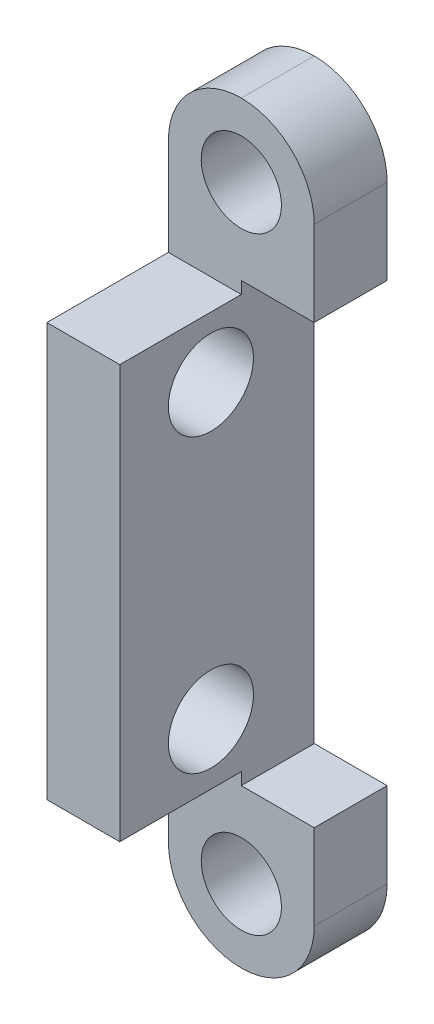
ISO-10303-21;
HEADER;
FILE_DESCRIPTION(('STEP AP214'),'2;1');
FILE_NAME('part.step','',(''),(''),'','','');
FILE_SCHEMA(('AUTOMOTIVE_DESIGN { 1 0 10303 214 1 1 1 1 }'));
ENDSEC;
DATA;
#1=APPLICATION_CONTEXT('core data for automotive mechanical design processes');
#2=APPLICATION_PROTOCOL_DEFINITION('international standard','automotive_design',2000,#1);
#3=PRODUCT_CONTEXT('',#1,'mechanical');
#4=PRODUCT('Part','Part','',(#3));
#5=PRODUCT_RELATED_PRODUCT_CATEGORY('part','',(#4));
#6=PRODUCT_DEFINITION_FORMATION('','',#4);
#7=PRODUCT_DEFINITION_CONTEXT('part definition',#1,'design');
#8=PRODUCT_DEFINITION('design','',#6,#7);
#9=PRODUCT_DEFINITION_SHAPE('','',#8);
#10=(LENGTH_UNIT() NAMED_UNIT(*) SI_UNIT(.MILLI.,.METRE.));
#11=(NAMED_UNIT(*) PLANE_ANGLE_UNIT() SI_UNIT($,.RADIAN.));
#12=(NAMED_UNIT(*) SI_UNIT($,.STERADIAN.) SOLID_ANGLE_UNIT());
#13=UNCERTAINTY_MEASURE_WITH_UNIT(LENGTH_MEASURE(1.E-05),#10,'distance_accuracy_value','');
#14=(GEOMETRIC_REPRESENTATION_CONTEXT(3) GLOBAL_UNCERTAINTY_ASSIGNED_CONTEXT((#13)) GLOBAL_UNIT_ASSIGNED_CONTEXT((#10,
#11,#12)) REPRESENTATION_CONTEXT('',''));
#15=CARTESIAN_POINT('',(0.,0.,0.));
#16=DIRECTION('',(0.,0.,1.));
#17=DIRECTION('',(1.,0.,0.));
#18=AXIS2_PLACEMENT_3D('',#15,#16,#17);
#19=CARTESIAN_POINT('',(0.,0.,8.));
#20=DIRECTION('',(0.,0.,-1.));
#21=DIRECTION('',(-1.,0.,0.));
#22=AXIS2_PLACEMENT_3D('',#19,#20,#21);
#23=PLANE('',#22);
#24=DIRECTION('',(0.,-1.,0.));
#25=VECTOR('',#24,1.);
#26=CARTESIAN_POINT('',(0.,0.,8.));
#27=LINE('',#26,#25);
#28=CARTESIAN_POINT('',(0.,24.,8.));
#29=VERTEX_POINT('',#28);
#30=CARTESIAN_POINT('',(0.,7.,8.));
#31=VERTEX_POINT('',#30);
#32=EDGE_CURVE('E151',#29,#31,#27,.T.);
#33=ORIENTED_EDGE('',*,*,#32,.T.);
#34=DIRECTION('',(-1.,0.,0.));
#35=VECTOR('',#34,1.);
#36=CARTESIAN_POINT('',(6.,7.,8.));
#37=LINE('',#36,#35);
#38=CARTESIAN_POINT('',(3.,7.,8.));
#39=VERTEX_POINT('',#38);
#40=EDGE_CURVE('E134',#39,#31,#37,.T.);
#41=ORIENTED_EDGE('',*,*,#40,.F.);
#42=DIRECTION('',(0.,1.,0.));
#43=VECTOR('',#42,1.);
#44=CARTESIAN_POINT('',(3.,24.5,8.));
#45=LINE('',#44,#43);
#46=CARTESIAN_POINT('',(3.,24.,8.));
#47=VERTEX_POINT('',#46);
#48=EDGE_CURVE('E157',#39,#47,#45,.T.);
#49=ORIENTED_EDGE('',*,*,#48,.T.);
#50=DIRECTION('',(-1.,0.,0.));
#51=VECTOR('',#50,1.);
#52=CARTESIAN_POINT('',(6.,24.,8.));
#53=LINE('',#52,#51);
#54=EDGE_CURVE('E156',#47,#29,#53,.T.);
#55=ORIENTED_EDGE('',*,*,#54,.T.);
#56=EDGE_LOOP('',(#33,#41,#49,#55));
#57=FACE_BOUND('',#56,.T.);
#58=ADVANCED_FACE('F33',(#57),#23,.F.);
#59=CARTESIAN_POINT('',(0.,0.,0.));
#60=DIRECTION('',(0.,0.,-1.));
#61=DIRECTION('',(-1.,0.,0.));
#62=AXIS2_PLACEMENT_3D('',#59,#60,#61);
#63=PLANE('',#62);
#64=CARTESIAN_POINT('',(3.,28.,0.));
#65=DIRECTION('',(0.,0.,1.));
#66=DIRECTION('',(1.,0.,0.));
#67=AXIS2_PLACEMENT_3D('',#64,#65,#66);
#68=CIRCLE('',#67,1.65);
#69=CARTESIAN_POINT('',(4.65,28.,0.));
#70=VERTEX_POINT('',#69);
#71=EDGE_CURVE('E166',#70,#70,#68,.T.);
#72=ORIENTED_EDGE('',*,*,#71,.T.);
#73=EDGE_LOOP('',(#72));
#74=FACE_BOUND('',#73,.T.);
#75=DIRECTION('',(0.,1.,0.));
#76=VECTOR('',#75,1.);
#77=CARTESIAN_POINT('',(6.,0.,0.));
#78=LINE('',#77,#76);
#79=CARTESIAN_POINT('',(6.,3.,0.));
#80=VERTEX_POINT('',#79);
#81=CARTESIAN_POINT('',(6.,6.5,0.));
#82=VERTEX_POINT('',#81);
#83=EDGE_CURVE('E172',#80,#82,#78,.T.);
#84=ORIENTED_EDGE('',*,*,#83,.F.);
#85=CARTESIAN_POINT('',(3.,3.,0.));
#86=DIRECTION('',(0.,0.,-1.));
#87=DIRECTION('',(-1.,0.,0.));
#88=AXIS2_PLACEMENT_3D('',#85,#86,#87);
#89=CIRCLE('',#88,3.);
#90=CARTESIAN_POINT('',(3.,0.,0.));
#91=VERTEX_POINT('',#90);
#92=EDGE_CURVE('E205',#80,#91,#89,.T.);
#93=ORIENTED_EDGE('',*,*,#92,.T.);
#94=CARTESIAN_POINT('',(3.,3.,0.));
#95=DIRECTION('',(0.,0.,-1.));
#96=DIRECTION('',(-1.,0.,0.));
#97=AXIS2_PLACEMENT_3D('',#94,#95,#96);
#98=CIRCLE('',#97,3.);
#99=CARTESIAN_POINT('',(0.,3.,0.));
#100=VERTEX_POINT('',#99);
#101=EDGE_CURVE('E203',#91,#100,#98,.T.);
#102=ORIENTED_EDGE('',*,*,#101,.T.);
#103=DIRECTION('',(0.,-1.,0.));
#104=VECTOR('',#103,1.);
#105=CARTESIAN_POINT('',(0.,0.,0.));
#106=LINE('',#105,#104);
#107=CARTESIAN_POINT('',(0.,28.,0.));
#108=VERTEX_POINT('',#107);
#109=EDGE_CURVE('E169',#108,#100,#106,.T.);
#110=ORIENTED_EDGE('',*,*,#109,.F.);
#111=CARTESIAN_POINT('',(3.,28.,0.));
#112=DIRECTION('',(0.,0.,-1.));
#113=DIRECTION('',(-1.,0.,0.));
#114=AXIS2_PLACEMENT_3D('',#111,#112,#113);
#115=CIRCLE('',#114,3.);
#116=CARTESIAN_POINT('',(3.,31.,0.));
#117=VERTEX_POINT('',#116);
#118=EDGE_CURVE('E190',#108,#117,#115,.T.);
#119=ORIENTED_EDGE('',*,*,#118,.T.);
#120=CARTESIAN_POINT('',(3.,28.,0.));
#121=DIRECTION('',(0.,0.,-1.));
#122=DIRECTION('',(-1.,0.,0.));
#123=AXIS2_PLACEMENT_3D('',#120,#121,#122);
#124=CIRCLE('',#123,3.);
#125=CARTESIAN_POINT('',(6.,28.,0.));
#126=VERTEX_POINT('',#125);
#127=EDGE_CURVE('E201',#117,#126,#124,.T.);
#128=ORIENTED_EDGE('',*,*,#127,.T.);
#129=DIRECTION('',(0.,1.,0.));
#130=VECTOR('',#129,1.);
#131=CARTESIAN_POINT('',(6.,24.5,0.));
#132=LINE('',#131,#130);
#133=CARTESIAN_POINT('',(6.,24.5,0.));
#134=VERTEX_POINT('',#133);
#135=EDGE_CURVE('E158',#134,#126,#132,.T.);
#136=ORIENTED_EDGE('',*,*,#135,.F.);
#137=DIRECTION('',(1.,0.,0.));
#138=VECTOR('',#137,1.);
#139=CARTESIAN_POINT('',(6.,24.5,0.));
#140=LINE('',#139,#138);
#141=CARTESIAN_POINT('',(3.,24.5,0.));
#142=VERTEX_POINT('',#141);
#143=EDGE_CURVE('E163',#142,#134,#140,.T.);
#144=ORIENTED_EDGE('',*,*,#143,.F.);
#145=DIRECTION('',(0.,1.,0.));
#146=VECTOR('',#145,1.);
#147=CARTESIAN_POINT('',(3.,24.5,0.));
#148=LINE('',#147,#146);
#149=CARTESIAN_POINT('',(3.,6.5,0.));
#150=VERTEX_POINT('',#149);
#151=EDGE_CURVE('E178',#150,#142,#148,.T.);
#152=ORIENTED_EDGE('',*,*,#151,.F.);
#153=DIRECTION('',(-1.,0.,0.));
#154=VECTOR('',#153,1.);
#155=CARTESIAN_POINT('',(3.,6.5,0.));
#156=LINE('',#155,#154);
#157=EDGE_CURVE('E175',#82,#150,#156,.T.);
#158=ORIENTED_EDGE('',*,*,#157,.F.);
#159=EDGE_LOOP('',(#84,#93,#102,#110,#119,#128,#136,#144,#152,#158));
#160=FACE_BOUND('',#159,.T.);
#161=CARTESIAN_POINT('',(3.,3.,0.));
#162=DIRECTION('',(0.,0.,1.));
#163=DIRECTION('',(-1.,0.,0.));
#164=AXIS2_PLACEMENT_3D('',#161,#162,#163);
#165=CIRCLE('',#164,1.65);
#166=CARTESIAN_POINT('',(1.35,3.,0.));
#167=VERTEX_POINT('',#166);
#168=EDGE_CURVE('E194',#167,#167,#165,.T.);
#169=ORIENTED_EDGE('',*,*,#168,.T.);
#170=EDGE_LOOP('',(#169));
#171=FACE_BOUND('',#170,.T.);
#172=ADVANCED_FACE('F243',(#74,#160,#171),#63,.T.);
#173=CARTESIAN_POINT('',(0.,0.,8.));
#174=DIRECTION('',(1.,0.,0.));
#175=DIRECTION('',(0.,0.,-1.));
#176=AXIS2_PLACEMENT_3D('',#173,#174,#175);
#177=PLANE('',#176);
#178=CARTESIAN_POINT('',(0.,9.5,4.25));
#179=DIRECTION('',(-1.,0.,0.));
#180=DIRECTION('',(0.,0.,1.));
#181=AXIS2_PLACEMENT_3D('',#178,#179,#180);
#182=CIRCLE('',#181,1.75);
#183=CARTESIAN_POINT('',(0.,9.5,6.));
#184=VERTEX_POINT('',#183);
#185=EDGE_CURVE('E199',#184,#184,#182,.T.);
#186=ORIENTED_EDGE('',*,*,#185,.F.);
#187=EDGE_LOOP('',(#186));
#188=FACE_BOUND('',#187,.T.);
#189=CARTESIAN_POINT('',(0.,21.5,4.25));
#190=DIRECTION('',(-1.,0.,0.));
#191=DIRECTION('',(0.,0.,1.));
#192=AXIS2_PLACEMENT_3D('',#189,#190,#191);
#193=CIRCLE('',#192,1.75);
#194=CARTESIAN_POINT('',(0.,21.5,6.));
#195=VERTEX_POINT('',#194);
#196=EDGE_CURVE('E195',#195,#195,#193,.T.);
#197=ORIENTED_EDGE('',*,*,#196,.F.);
#198=EDGE_LOOP('',(#197));
#199=FACE_BOUND('',#198,.T.);
#200=DIRECTION('',(0.,0.,-1.));
#201=VECTOR('',#200,1.);
#202=CARTESIAN_POINT('',(0.,3.,8.));
#203=LINE('',#202,#201);
#204=CARTESIAN_POINT('',(0.,3.,3.));
#205=VERTEX_POINT('',#204);
#206=EDGE_CURVE('E215',#100,#205,#203,.F.);
#207=ORIENTED_EDGE('',*,*,#206,.T.);
#208=DIRECTION('',(0.,-1.,0.));
#209=VECTOR('',#208,1.);
#210=CARTESIAN_POINT('',(0.,0.,3.));
#211=LINE('',#210,#209);
#212=CARTESIAN_POINT('',(0.,7.,3.));
#213=VERTEX_POINT('',#212);
#214=EDGE_CURVE('E152',#213,#205,#211,.T.);
#215=ORIENTED_EDGE('',*,*,#214,.F.);
#216=DIRECTION('',(0.,0.,-1.));
#217=VECTOR('',#216,1.);
#218=CARTESIAN_POINT('',(0.,7.,8.));
#219=LINE('',#218,#217);
#220=EDGE_CURVE('E138',#31,#213,#219,.T.);
#221=ORIENTED_EDGE('',*,*,#220,.F.);
#222=ORIENTED_EDGE('',*,*,#32,.F.);
#223=DIRECTION('',(0.,0.,1.));
#224=VECTOR('',#223,1.);
#225=CARTESIAN_POINT('',(0.,24.,8.));
#226=LINE('',#225,#224);
#227=CARTESIAN_POINT('',(0.,24.,3.));
#228=VERTEX_POINT('',#227);
#229=EDGE_CURVE('E256',#228,#29,#226,.T.);
#230=ORIENTED_EDGE('',*,*,#229,.F.);
#231=DIRECTION('',(0.,-1.,0.));
#232=VECTOR('',#231,1.);
#233=CARTESIAN_POINT('',(0.,31.,3.));
#234=LINE('',#233,#232);
#235=CARTESIAN_POINT('',(0.,28.,3.));
#236=VERTEX_POINT('',#235);
#237=EDGE_CURVE('E252',#236,#228,#234,.T.);
#238=ORIENTED_EDGE('',*,*,#237,.F.);
#239=DIRECTION('',(0.,0.,-1.));
#240=VECTOR('',#239,1.);
#241=CARTESIAN_POINT('',(0.,28.,8.));
#242=LINE('',#241,#240);
#243=EDGE_CURVE('E213',#236,#108,#242,.T.);
#244=ORIENTED_EDGE('',*,*,#243,.T.);
#245=ORIENTED_EDGE('',*,*,#109,.T.);
#246=EDGE_LOOP('',(#207,#215,#221,#222,#230,#238,#244,#245));
#247=FACE_BOUND('',#246,.T.);
#248=ADVANCED_FACE('F149',(#188,#199,#247),#177,.F.);
#249=CARTESIAN_POINT('',(6.,0.,8.));
#250=DIRECTION('',(-1.,0.,0.));
#251=DIRECTION('',(0.,0.,1.));
#252=AXIS2_PLACEMENT_3D('',#249,#250,#251);
#253=PLANE('',#252);
#254=DIRECTION('',(0.,0.,-1.));
#255=VECTOR('',#254,1.);
#256=CARTESIAN_POINT('',(6.,6.5,8.));
#257=LINE('',#256,#255);
#258=CARTESIAN_POINT('',(6.,6.5,3.));
#259=VERTEX_POINT('',#258);
#260=EDGE_CURVE('E188',#259,#82,#257,.T.);
#261=ORIENTED_EDGE('',*,*,#260,.F.);
#262=DIRECTION('',(0.,-1.,0.));
#263=VECTOR('',#262,1.);
#264=CARTESIAN_POINT('',(6.,0.,3.));
#265=LINE('',#264,#263);
#266=CARTESIAN_POINT('',(6.,3.,3.));
#267=VERTEX_POINT('',#266);
#268=EDGE_CURVE('E144',#259,#267,#265,.T.);
#269=ORIENTED_EDGE('',*,*,#268,.T.);
#270=DIRECTION('',(0.,0.,-1.));
#271=VECTOR('',#270,1.);
#272=CARTESIAN_POINT('',(6.,3.,8.));
#273=LINE('',#272,#271);
#274=EDGE_CURVE('E211',#267,#80,#273,.T.);
#275=ORIENTED_EDGE('',*,*,#274,.T.);
#276=ORIENTED_EDGE('',*,*,#83,.T.);
#277=EDGE_LOOP('',(#261,#269,#275,#276));
#278=FACE_BOUND('',#277,.T.);
#279=ADVANCED_FACE('F235',(#278),#253,.F.);
#280=CARTESIAN_POINT('',(3.,6.5,8.));
#281=DIRECTION('',(0.,-1.,0.));
#282=DIRECTION('',(0.,0.,-1.));
#283=AXIS2_PLACEMENT_3D('',#280,#281,#282);
#284=PLANE('',#283);
#285=DIRECTION('',(0.,0.,-1.));
#286=VECTOR('',#285,1.);
#287=CARTESIAN_POINT('',(3.,6.5,8.));
#288=LINE('',#287,#286);
#289=CARTESIAN_POINT('',(3.,6.5,3.));
#290=VERTEX_POINT('',#289);
#291=EDGE_CURVE('E186',#290,#150,#288,.T.);
#292=ORIENTED_EDGE('',*,*,#291,.F.);
#293=DIRECTION('',(1.,0.,0.));
#294=VECTOR('',#293,1.);
#295=CARTESIAN_POINT('',(3.,6.5,3.));
#296=LINE('',#295,#294);
#297=EDGE_CURVE('E250',#290,#259,#296,.T.);
#298=ORIENTED_EDGE('',*,*,#297,.T.);
#299=ORIENTED_EDGE('',*,*,#260,.T.);
#300=ORIENTED_EDGE('',*,*,#157,.T.);
#301=EDGE_LOOP('',(#292,#298,#299,#300));
#302=FACE_BOUND('',#301,.T.);
#303=ADVANCED_FACE('F249',(#302),#284,.F.);
#304=CARTESIAN_POINT('',(3.,24.5,8.));
#305=DIRECTION('',(-1.,0.,0.));
#306=DIRECTION('',(0.,-1.,0.));
#307=AXIS2_PLACEMENT_3D('',#304,#305,#306);
#308=PLANE('',#307);
#309=CARTESIAN_POINT('',(3.,9.5,4.25));
#310=DIRECTION('',(-1.,0.,0.));
#311=DIRECTION('',(0.,-1.,0.));
#312=AXIS2_PLACEMENT_3D('',#309,#310,#311);
#313=CIRCLE('',#312,1.75);
#314=CARTESIAN_POINT('',(3.,7.75,4.25));
#315=VERTEX_POINT('',#314);
#316=EDGE_CURVE('E196',#315,#315,#313,.T.);
#317=ORIENTED_EDGE('',*,*,#316,.T.);
#318=EDGE_LOOP('',(#317));
#319=FACE_BOUND('',#318,.T.);
#320=CARTESIAN_POINT('',(3.,21.5,4.25));
#321=DIRECTION('',(-1.,0.,0.));
#322=DIRECTION('',(0.,-1.,0.));
#323=AXIS2_PLACEMENT_3D('',#320,#321,#322);
#324=CIRCLE('',#323,1.75);
#325=CARTESIAN_POINT('',(3.,19.75,4.25));
#326=VERTEX_POINT('',#325);
#327=EDGE_CURVE('E191',#326,#326,#324,.T.);
#328=ORIENTED_EDGE('',*,*,#327,.T.);
#329=EDGE_LOOP('',(#328));
#330=FACE_BOUND('',#329,.T.);
#331=DIRECTION('',(0.,0.,-1.));
#332=VECTOR('',#331,1.);
#333=CARTESIAN_POINT('',(3.,7.,8.));
#334=LINE('',#333,#332);
#335=CARTESIAN_POINT('',(3.,7.,3.));
#336=VERTEX_POINT('',#335);
#337=EDGE_CURVE('E11',#39,#336,#334,.T.);
#338=ORIENTED_EDGE('',*,*,#337,.T.);
#339=DIRECTION('',(0.,-1.,0.));
#340=VECTOR('',#339,1.);
#341=CARTESIAN_POINT('',(3.,24.5,3.));
#342=LINE('',#341,#340);
#343=EDGE_CURVE('E253',#336,#290,#342,.T.);
#344=ORIENTED_EDGE('',*,*,#343,.T.);
#345=ORIENTED_EDGE('',*,*,#291,.T.);
#346=ORIENTED_EDGE('',*,*,#151,.T.);
#347=DIRECTION('',(0.,0.,-1.));
#348=VECTOR('',#347,1.);
#349=CARTESIAN_POINT('',(3.,24.5,8.));
#350=LINE('',#349,#348);
#351=CARTESIAN_POINT('',(3.,24.5,3.));
#352=VERTEX_POINT('',#351);
#353=EDGE_CURVE('E184',#352,#142,#350,.T.);
#354=ORIENTED_EDGE('',*,*,#353,.F.);
#355=DIRECTION('',(0.,-1.,0.));
#356=VECTOR('',#355,1.);
#357=CARTESIAN_POINT('',(3.,24.5,3.));
#358=LINE('',#357,#356);
#359=CARTESIAN_POINT('',(3.,24.,3.));
#360=VERTEX_POINT('',#359);
#361=EDGE_CURVE('E223',#352,#360,#358,.T.);
#362=ORIENTED_EDGE('',*,*,#361,.T.);
#363=DIRECTION('',(0.,0.,1.));
#364=VECTOR('',#363,1.);
#365=CARTESIAN_POINT('',(3.,24.,8.));
#366=LINE('',#365,#364);
#367=EDGE_CURVE('E225',#360,#47,#366,.T.);
#368=ORIENTED_EDGE('',*,*,#367,.T.);
#369=ORIENTED_EDGE('',*,*,#48,.F.);
#370=EDGE_LOOP('',(#338,#344,#345,#346,#354,#362,#368,#369));
#371=FACE_BOUND('',#370,.T.);
#372=ADVANCED_FACE('F312',(#319,#330,#371),#308,.F.);
#373=CARTESIAN_POINT('',(6.,24.5,8.));
#374=DIRECTION('',(0.,1.,0.));
#375=DIRECTION('',(0.,0.,1.));
#376=AXIS2_PLACEMENT_3D('',#373,#374,#375);
#377=PLANE('',#376);
#378=DIRECTION('',(0.,0.,-1.));
#379=VECTOR('',#378,1.);
#380=CARTESIAN_POINT('',(6.,24.5,8.));
#381=LINE('',#380,#379);
#382=CARTESIAN_POINT('',(6.,24.5,3.));
#383=VERTEX_POINT('',#382);
#384=EDGE_CURVE('E160',#383,#134,#381,.T.);
#385=ORIENTED_EDGE('',*,*,#384,.F.);
#386=DIRECTION('',(-1.,0.,0.));
#387=VECTOR('',#386,1.);
#388=CARTESIAN_POINT('',(6.,24.5,3.));
#389=LINE('',#388,#387);
#390=EDGE_CURVE('E272',#383,#352,#389,.T.);
#391=ORIENTED_EDGE('',*,*,#390,.T.);
#392=ORIENTED_EDGE('',*,*,#353,.T.);
#393=ORIENTED_EDGE('',*,*,#143,.T.);
#394=EDGE_LOOP('',(#385,#391,#392,#393));
#395=FACE_BOUND('',#394,.T.);
#396=ADVANCED_FACE('F299',(#395),#377,.F.);
#397=CARTESIAN_POINT('',(6.,24.5,8.));
#398=DIRECTION('',(-1.,0.,0.));
#399=DIRECTION('',(0.,0.,1.));
#400=AXIS2_PLACEMENT_3D('',#397,#398,#399);
#401=PLANE('',#400);
#402=DIRECTION('',(0.,0.,-1.));
#403=VECTOR('',#402,1.);
#404=CARTESIAN_POINT('',(6.,28.,8.));
#405=LINE('',#404,#403);
#406=CARTESIAN_POINT('',(6.,28.,3.));
#407=VERTEX_POINT('',#406);
#408=EDGE_CURVE('E208',#126,#407,#405,.F.);
#409=ORIENTED_EDGE('',*,*,#408,.T.);
#410=DIRECTION('',(0.,-1.,0.));
#411=VECTOR('',#410,1.);
#412=CARTESIAN_POINT('',(6.,31.,3.));
#413=LINE('',#412,#411);
#414=EDGE_CURVE('E56',#407,#383,#413,.T.);
#415=ORIENTED_EDGE('',*,*,#414,.T.);
#416=ORIENTED_EDGE('',*,*,#384,.T.);
#417=ORIENTED_EDGE('',*,*,#135,.T.);
#418=EDGE_LOOP('',(#409,#415,#416,#417));
#419=FACE_BOUND('',#418,.T.);
#420=ADVANCED_FACE('F289',(#419),#401,.F.);
#421=CARTESIAN_POINT('',(3.,28.,8.));
#422=DIRECTION('',(0.,0.,-1.));
#423=DIRECTION('',(-1.,0.,0.));
#424=AXIS2_PLACEMENT_3D('',#421,#422,#423);
#425=CYLINDRICAL_SURFACE('',#424,1.65);
#426=CARTESIAN_POINT('',(3.,28.,3.));
#427=DIRECTION('',(0.,0.,-1.));
#428=DIRECTION('',(0.,1.,0.));
#429=AXIS2_PLACEMENT_3D('',#426,#427,#428);
#430=CIRCLE('',#429,1.65);
#431=CARTESIAN_POINT('',(3.,29.65,3.));
#432=VERTEX_POINT('',#431);
#433=EDGE_CURVE('E269',#432,#432,#430,.T.);
#434=ORIENTED_EDGE('',*,*,#433,.F.);
#435=EDGE_LOOP('',(#434));
#436=FACE_BOUND('',#435,.T.);
#437=ORIENTED_EDGE('',*,*,#71,.F.);
#438=EDGE_LOOP('',(#437));
#439=FACE_BOUND('',#438,.T.);
#440=ADVANCED_FACE('F286',(#436,#439),#425,.F.);
#441=CARTESIAN_POINT('',(3.,3.,8.));
#442=DIRECTION('',(0.,0.,-1.));
#443=DIRECTION('',(-1.,0.,0.));
#444=AXIS2_PLACEMENT_3D('',#441,#442,#443);
#445=CYLINDRICAL_SURFACE('',#444,1.65);
#446=CARTESIAN_POINT('',(3.,3.,3.));
#447=DIRECTION('',(0.,0.,-1.));
#448=DIRECTION('',(-1.,0.,0.));
#449=AXIS2_PLACEMENT_3D('',#446,#447,#448);
#450=CIRCLE('',#449,1.65);
#451=CARTESIAN_POINT('',(1.35,3.,3.));
#452=VERTEX_POINT('',#451);
#453=EDGE_CURVE('E258',#452,#452,#450,.T.);
#454=ORIENTED_EDGE('',*,*,#453,.F.);
#455=EDGE_LOOP('',(#454));
#456=FACE_BOUND('',#455,.T.);
#457=ORIENTED_EDGE('',*,*,#168,.F.);
#458=EDGE_LOOP('',(#457));
#459=FACE_BOUND('',#458,.T.);
#460=ADVANCED_FACE('F288',(#456,#459),#445,.F.);
#461=CARTESIAN_POINT('',(6.,21.5,4.25));
#462=DIRECTION('',(-1.,0.,0.));
#463=DIRECTION('',(0.,0.,1.));
#464=AXIS2_PLACEMENT_3D('',#461,#462,#463);
#465=CYLINDRICAL_SURFACE('',#464,1.75);
#466=ORIENTED_EDGE('',*,*,#196,.T.);
#467=EDGE_LOOP('',(#466));
#468=FACE_BOUND('',#467,.T.);
#469=ORIENTED_EDGE('',*,*,#327,.F.);
#470=EDGE_LOOP('',(#469));
#471=FACE_BOUND('',#470,.T.);
#472=ADVANCED_FACE('F296',(#468,#471),#465,.F.);
#473=CARTESIAN_POINT('',(6.,9.5,4.25));
#474=DIRECTION('',(-1.,0.,0.));
#475=DIRECTION('',(0.,0.,1.));
#476=AXIS2_PLACEMENT_3D('',#473,#474,#475);
#477=CYLINDRICAL_SURFACE('',#476,1.75);
#478=ORIENTED_EDGE('',*,*,#185,.T.);
#479=EDGE_LOOP('',(#478));
#480=FACE_BOUND('',#479,.T.);
#481=ORIENTED_EDGE('',*,*,#316,.F.);
#482=EDGE_LOOP('',(#481));
#483=FACE_BOUND('',#482,.T.);
#484=ADVANCED_FACE('F330',(#480,#483),#477,.F.);
#485=CARTESIAN_POINT('',(3.,28.,8.));
#486=DIRECTION('',(0.,0.,-1.));
#487=DIRECTION('',(-1.,0.,0.));
#488=AXIS2_PLACEMENT_3D('',#485,#486,#487);
#489=CYLINDRICAL_SURFACE('',#488,3.);
#490=CARTESIAN_POINT('',(3.,28.,3.));
#491=DIRECTION('',(0.,0.,-1.));
#492=DIRECTION('',(0.,1.,0.));
#493=AXIS2_PLACEMENT_3D('',#490,#491,#492);
#494=CIRCLE('',#493,3.);
#495=CARTESIAN_POINT('',(3.,31.,3.));
#496=VERTEX_POINT('',#495);
#497=EDGE_CURVE('E266',#496,#236,#494,.F.);
#498=ORIENTED_EDGE('',*,*,#497,.F.);
#499=DIRECTION('',(0.,0.,-1.));
#500=VECTOR('',#499,1.);
#501=CARTESIAN_POINT('',(3.,31.,8.));
#502=LINE('',#501,#500);
#503=EDGE_CURVE('E218',#117,#496,#502,.F.);
#504=ORIENTED_EDGE('',*,*,#503,.F.);
#505=ORIENTED_EDGE('',*,*,#118,.F.);
#506=ORIENTED_EDGE('',*,*,#243,.F.);
#507=EDGE_LOOP('',(#498,#504,#505,#506));
#508=FACE_BOUND('',#507,.T.);
#509=ADVANCED_FACE('F327',(#508),#489,.T.);
#510=CARTESIAN_POINT('',(3.,28.,8.));
#511=DIRECTION('',(0.,0.,-1.));
#512=DIRECTION('',(-1.,0.,0.));
#513=AXIS2_PLACEMENT_3D('',#510,#511,#512);
#514=CYLINDRICAL_SURFACE('',#513,3.);
#515=CARTESIAN_POINT('',(3.,28.,3.));
#516=DIRECTION('',(0.,0.,-1.));
#517=DIRECTION('',(0.,1.,0.));
#518=AXIS2_PLACEMENT_3D('',#515,#516,#517);
#519=CIRCLE('',#518,3.);
#520=EDGE_CURVE('E217',#407,#496,#519,.F.);
#521=ORIENTED_EDGE('',*,*,#520,.F.);
#522=ORIENTED_EDGE('',*,*,#408,.F.);
#523=ORIENTED_EDGE('',*,*,#127,.F.);
#524=ORIENTED_EDGE('',*,*,#503,.T.);
#525=EDGE_LOOP('',(#521,#522,#523,#524));
#526=FACE_BOUND('',#525,.T.);
#527=ADVANCED_FACE('F324',(#526),#514,.T.);
#528=CARTESIAN_POINT('',(3.,3.,8.));
#529=DIRECTION('',(0.,0.,-1.));
#530=DIRECTION('',(-1.,0.,0.));
#531=AXIS2_PLACEMENT_3D('',#528,#529,#530);
#532=CYLINDRICAL_SURFACE('',#531,3.);
#533=CARTESIAN_POINT('',(3.,3.,3.));
#534=DIRECTION('',(0.,0.,-1.));
#535=DIRECTION('',(-1.,0.,0.));
#536=AXIS2_PLACEMENT_3D('',#533,#534,#535);
#537=CIRCLE('',#536,3.);
#538=CARTESIAN_POINT('',(3.,0.,3.));
#539=VERTEX_POINT('',#538);
#540=EDGE_CURVE('E48',#205,#539,#537,.F.);
#541=ORIENTED_EDGE('',*,*,#540,.F.);
#542=ORIENTED_EDGE('',*,*,#206,.F.);
#543=ORIENTED_EDGE('',*,*,#101,.F.);
#544=DIRECTION('',(0.,0.,-1.));
#545=VECTOR('',#544,1.);
#546=CARTESIAN_POINT('',(3.,0.,8.));
#547=LINE('',#546,#545);
#548=EDGE_CURVE('E221',#539,#91,#547,.T.);
#549=ORIENTED_EDGE('',*,*,#548,.F.);
#550=EDGE_LOOP('',(#541,#542,#543,#549));
#551=FACE_BOUND('',#550,.T.);
#552=ADVANCED_FACE('F35',(#551),#532,.T.);
#553=CARTESIAN_POINT('',(3.,3.,8.));
#554=DIRECTION('',(0.,0.,-1.));
#555=DIRECTION('',(-1.,0.,0.));
#556=AXIS2_PLACEMENT_3D('',#553,#554,#555);
#557=CYLINDRICAL_SURFACE('',#556,3.);
#558=CARTESIAN_POINT('',(3.,3.,3.));
#559=DIRECTION('',(0.,0.,-1.));
#560=DIRECTION('',(-1.,0.,0.));
#561=AXIS2_PLACEMENT_3D('',#558,#559,#560);
#562=CIRCLE('',#561,3.);
#563=EDGE_CURVE('E41',#539,#267,#562,.F.);
#564=ORIENTED_EDGE('',*,*,#563,.F.);
#565=ORIENTED_EDGE('',*,*,#548,.T.);
#566=ORIENTED_EDGE('',*,*,#92,.F.);
#567=ORIENTED_EDGE('',*,*,#274,.F.);
#568=EDGE_LOOP('',(#564,#565,#566,#567));
#569=FACE_BOUND('',#568,.T.);
#570=ADVANCED_FACE('F238',(#569),#557,.T.);
#571=CARTESIAN_POINT('',(6.,24.,8.));
#572=DIRECTION('',(0.,-1.,0.));
#573=DIRECTION('',(0.,0.,-1.));
#574=AXIS2_PLACEMENT_3D('',#571,#572,#573);
#575=PLANE('',#574);
#576=DIRECTION('',(-1.,0.,0.));
#577=VECTOR('',#576,1.);
#578=CARTESIAN_POINT('',(6.,24.,3.));
#579=LINE('',#578,#577);
#580=EDGE_CURVE('E262',#360,#228,#579,.T.);
#581=ORIENTED_EDGE('',*,*,#580,.T.);
#582=ORIENTED_EDGE('',*,*,#229,.T.);
#583=ORIENTED_EDGE('',*,*,#54,.F.);
#584=ORIENTED_EDGE('',*,*,#367,.F.);
#585=EDGE_LOOP('',(#581,#582,#583,#584));
#586=FACE_BOUND('',#585,.T.);
#587=ADVANCED_FACE('F333',(#586),#575,.F.);
#588=CARTESIAN_POINT('',(6.,31.,3.));
#589=DIRECTION('',(0.,0.,-1.));
#590=DIRECTION('',(0.,1.,0.));
#591=AXIS2_PLACEMENT_3D('',#588,#589,#590);
#592=PLANE('',#591);
#593=ORIENTED_EDGE('',*,*,#433,.T.);
#594=EDGE_LOOP('',(#593));
#595=FACE_BOUND('',#594,.T.);
#596=ORIENTED_EDGE('',*,*,#390,.F.);
#597=ORIENTED_EDGE('',*,*,#414,.F.);
#598=ORIENTED_EDGE('',*,*,#520,.T.);
#599=ORIENTED_EDGE('',*,*,#497,.T.);
#600=ORIENTED_EDGE('',*,*,#237,.T.);
#601=ORIENTED_EDGE('',*,*,#580,.F.);
#602=ORIENTED_EDGE('',*,*,#361,.F.);
#603=EDGE_LOOP('',(#596,#597,#598,#599,#600,#601,#602));
#604=FACE_BOUND('',#603,.T.);
#605=ADVANCED_FACE('F338',(#595,#604),#592,.F.);
#606=CARTESIAN_POINT('',(6.,7.,8.));
#607=DIRECTION('',(0.,1.,0.));
#608=DIRECTION('',(0.,0.,1.));
#609=AXIS2_PLACEMENT_3D('',#606,#607,#608);
#610=PLANE('',#609);
#611=ORIENTED_EDGE('',*,*,#40,.T.);
#612=ORIENTED_EDGE('',*,*,#220,.T.);
#613=DIRECTION('',(-1.,0.,0.));
#614=VECTOR('',#613,1.);
#615=CARTESIAN_POINT('',(6.,7.,3.));
#616=LINE('',#615,#614);
#617=EDGE_CURVE('E143',#336,#213,#616,.T.);
#618=ORIENTED_EDGE('',*,*,#617,.F.);
#619=ORIENTED_EDGE('',*,*,#337,.F.);
#620=EDGE_LOOP('',(#611,#612,#618,#619));
#621=FACE_BOUND('',#620,.T.);
#622=ADVANCED_FACE('F136',(#621),#610,.F.);
#623=CARTESIAN_POINT('',(6.,0.,3.));
#624=DIRECTION('',(0.,0.,-1.));
#625=DIRECTION('',(-1.,0.,0.));
#626=AXIS2_PLACEMENT_3D('',#623,#624,#625);
#627=PLANE('',#626);
#628=ORIENTED_EDGE('',*,*,#453,.T.);
#629=EDGE_LOOP('',(#628));
#630=FACE_BOUND('',#629,.T.);
#631=ORIENTED_EDGE('',*,*,#343,.F.);
#632=ORIENTED_EDGE('',*,*,#617,.T.);
#633=ORIENTED_EDGE('',*,*,#214,.T.);
#634=ORIENTED_EDGE('',*,*,#540,.T.);
#635=ORIENTED_EDGE('',*,*,#563,.T.);
#636=ORIENTED_EDGE('',*,*,#268,.F.);
#637=ORIENTED_EDGE('',*,*,#297,.F.);
#638=EDGE_LOOP('',(#631,#632,#633,#634,#635,#636,#637));
#639=FACE_BOUND('',#638,.T.);
#640=ADVANCED_FACE('F228',(#630,#639),#627,.F.);
#641=CLOSED_SHELL('',(#58,#172,#248,#279,#303,#372,#396,#420,#440,#460,#472,#484,#509,#527,#552,
#570,#587,#605,#622,#640));
#642=MANIFOLD_SOLID_BREP('B2',#641);
#643=ADVANCED_BREP_SHAPE_REPRESENTATION('',(#18,#642),#14);
#644=SHAPE_DEFINITION_REPRESENTATION(#9,#643);
ENDSEC;
END-ISO-10303-21;
